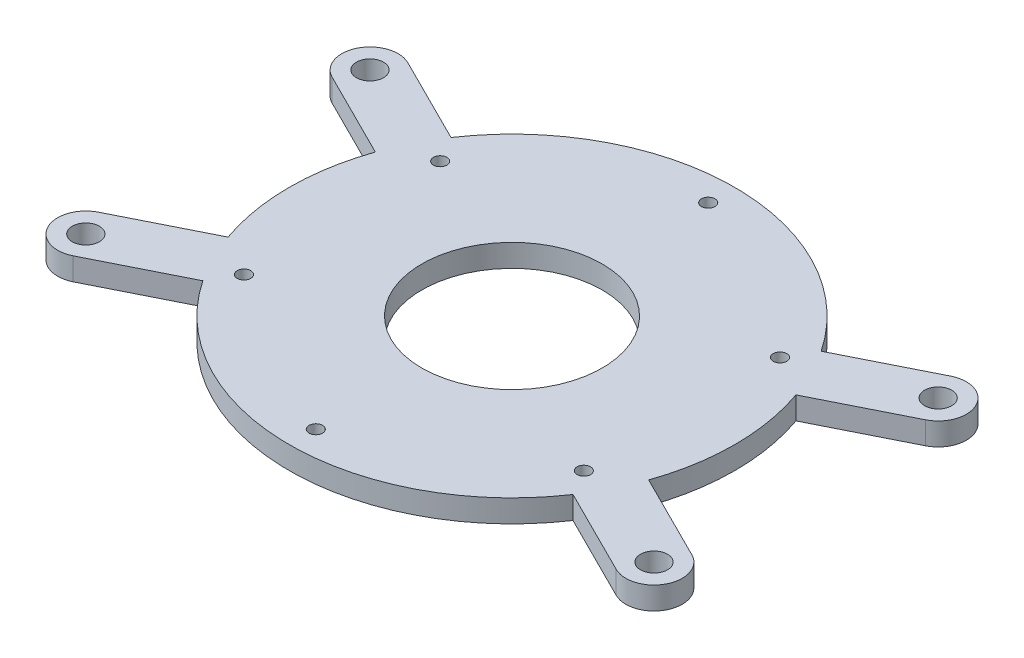
ISO-10303-21;
HEADER;
FILE_DESCRIPTION(('STEP AP214'),'2;1');
FILE_NAME('part.step','',(''),(''),'','','');
FILE_SCHEMA(('AUTOMOTIVE_DESIGN { 1 0 10303 214 1 1 1 1 }'));
ENDSEC;
DATA;
#1=APPLICATION_CONTEXT('core data for automotive mechanical design processes');
#2=APPLICATION_PROTOCOL_DEFINITION('international standard','automotive_design',2000,#1);
#3=PRODUCT_CONTEXT('',#1,'mechanical');
#4=PRODUCT('Part','Part','',(#3));
#5=PRODUCT_RELATED_PRODUCT_CATEGORY('part','',(#4));
#6=PRODUCT_DEFINITION_FORMATION('','',#4);
#7=PRODUCT_DEFINITION_CONTEXT('part definition',#1,'design');
#8=PRODUCT_DEFINITION('design','',#6,#7);
#9=PRODUCT_DEFINITION_SHAPE('','',#8);
#10=(LENGTH_UNIT() NAMED_UNIT(*) SI_UNIT(.MILLI.,.METRE.));
#11=(NAMED_UNIT(*) PLANE_ANGLE_UNIT() SI_UNIT($,.RADIAN.));
#12=(NAMED_UNIT(*) SI_UNIT($,.STERADIAN.) SOLID_ANGLE_UNIT());
#13=UNCERTAINTY_MEASURE_WITH_UNIT(LENGTH_MEASURE(1.E-05),#10,'distance_accuracy_value','');
#14=(GEOMETRIC_REPRESENTATION_CONTEXT(3) GLOBAL_UNCERTAINTY_ASSIGNED_CONTEXT((#13)) GLOBAL_UNIT_ASSIGNED_CONTEXT((#10,
#11,#12)) REPRESENTATION_CONTEXT('',''));
#15=CARTESIAN_POINT('',(0.,0.,0.));
#16=DIRECTION('',(0.,0.,1.));
#17=DIRECTION('',(1.,0.,0.));
#18=AXIS2_PLACEMENT_3D('',#15,#16,#17);
#19=CARTESIAN_POINT('',(0.,5.,0.));
#20=DIRECTION('',(0.,-1.,0.));
#21=DIRECTION('',(0.,0.,-1.));
#22=AXIS2_PLACEMENT_3D('',#19,#20,#21);
#23=CYLINDRICAL_SURFACE('',#22,49.4);
#24=CARTESIAN_POINT('',(0.,0.,0.));
#25=DIRECTION('',(0.,1.,0.));
#26=DIRECTION('',(0.,0.,1.));
#27=AXIS2_PLACEMENT_3D('',#24,#25,#26);
#28=CIRCLE('',#27,49.4);
#29=CARTESIAN_POINT('',(-41.0321866795471,0.,27.5085378799892));
#30=VERTEX_POINT('',#29);
#31=CARTESIAN_POINT('',(41.0321866795471,0.,27.5085378799892));
#32=VERTEX_POINT('',#31);
#33=EDGE_CURVE('E243',#30,#32,#28,.T.);
#34=ORIENTED_EDGE('',*,*,#33,.T.);
#35=DIRECTION('',(0.,-1.,0.));
#36=VECTOR('',#35,1.);
#37=CARTESIAN_POINT('',(41.0321866795471,5.,27.5085378799892));
#38=LINE('',#37,#36);
#39=CARTESIAN_POINT('',(41.0321866795471,5.,27.5085378799892));
#40=VERTEX_POINT('',#39);
#41=EDGE_CURVE('E12',#40,#32,#38,.T.);
#42=ORIENTED_EDGE('',*,*,#41,.F.);
#43=CARTESIAN_POINT('',(0.,5.,0.));
#44=DIRECTION('',(0.,1.,0.));
#45=DIRECTION('',(0.,0.,1.));
#46=AXIS2_PLACEMENT_3D('',#43,#44,#45);
#47=CIRCLE('',#46,49.4);
#48=CARTESIAN_POINT('',(-41.0321866795471,5.,27.5085378799892));
#49=VERTEX_POINT('',#48);
#50=EDGE_CURVE('E173',#49,#40,#47,.T.);
#51=ORIENTED_EDGE('',*,*,#50,.F.);
#52=DIRECTION('',(0.,-1.,0.));
#53=VECTOR('',#52,1.);
#54=CARTESIAN_POINT('',(-41.0321866795471,5.,27.5085378799892));
#55=LINE('',#54,#53);
#56=EDGE_CURVE('E239',#49,#30,#55,.T.);
#57=ORIENTED_EDGE('',*,*,#56,.T.);
#58=EDGE_LOOP('',(#34,#42,#51,#57));
#59=FACE_BOUND('',#58,.T.);
#60=ADVANCED_FACE('F91',(#59),#23,.T.);
#61=CARTESIAN_POINT('',(-2.79556780261695,5.,5.5899285023131));
#62=DIRECTION('',(-0.447290848418707,0.,0.894388560370085));
#63=DIRECTION('',(0.894388560370085,0.,0.447290848418707));
#64=AXIS2_PLACEMENT_3D('',#61,#62,#63);
#65=PLANE('',#64);
#66=DIRECTION('',(-0.894388560370085,0.,-0.447290848418707));
#67=VECTOR('',#66,1.);
#68=CARTESIAN_POINT('',(-2.79556780261695,0.,5.5899285023131));
#69=LINE('',#68,#67);
#70=CARTESIAN_POINT('',(60.1908307594318,0.,37.089928502313));
#71=VERTEX_POINT('',#70);
#72=EDGE_CURVE('E247',#71,#32,#69,.T.);
#73=ORIENTED_EDGE('',*,*,#72,.F.);
#74=DIRECTION('',(0.,-1.,0.));
#75=VECTOR('',#74,1.);
#76=CARTESIAN_POINT('',(60.1908307594318,5.,37.089928502313));
#77=LINE('',#76,#75);
#78=CARTESIAN_POINT('',(60.1908307594318,5.,37.089928502313));
#79=VERTEX_POINT('',#78);
#80=EDGE_CURVE('E101',#79,#71,#77,.T.);
#81=ORIENTED_EDGE('',*,*,#80,.F.);
#82=DIRECTION('',(-0.894388560370085,0.,-0.447290848418707));
#83=VECTOR('',#82,1.);
#84=CARTESIAN_POINT('',(-2.79556780261695,5.,5.5899285023131));
#85=LINE('',#84,#83);
#86=EDGE_CURVE('E323',#79,#40,#85,.T.);
#87=ORIENTED_EDGE('',*,*,#86,.T.);
#88=ORIENTED_EDGE('',*,*,#41,.T.);
#89=EDGE_LOOP('',(#73,#81,#87,#88));
#90=FACE_BOUND('',#89,.T.);
#91=ADVANCED_FACE('F404',(#90),#65,.T.);
#92=CARTESIAN_POINT('',(62.9863985620487,5.,31.5));
#93=DIRECTION('',(0.,-1.,0.));
#94=DIRECTION('',(0.,0.,-1.));
#95=AXIS2_PLACEMENT_3D('',#92,#93,#94);
#96=CYLINDRICAL_SURFACE('',#95,6.25);
#97=CARTESIAN_POINT('',(62.9863985620487,0.,31.5));
#98=DIRECTION('',(0.,1.,0.));
#99=DIRECTION('',(0.,0.,1.));
#100=AXIS2_PLACEMENT_3D('',#97,#98,#99);
#101=CIRCLE('',#100,6.25);
#102=CARTESIAN_POINT('',(65.7819663646656,0.,25.9100714976869));
#103=VERTEX_POINT('',#102);
#104=EDGE_CURVE('E252',#103,#71,#101,.F.);
#105=ORIENTED_EDGE('',*,*,#104,.F.);
#106=DIRECTION('',(0.,-1.,0.));
#107=VECTOR('',#106,1.);
#108=CARTESIAN_POINT('',(65.7819663646656,5.,25.9100714976869));
#109=LINE('',#108,#107);
#110=CARTESIAN_POINT('',(65.7819663646656,5.,25.9100714976869));
#111=VERTEX_POINT('',#110);
#112=EDGE_CURVE('E299',#111,#103,#109,.T.);
#113=ORIENTED_EDGE('',*,*,#112,.F.);
#114=CARTESIAN_POINT('',(62.9863985620487,5.,31.5));
#115=DIRECTION('',(0.,1.,0.));
#116=DIRECTION('',(0.,0.,1.));
#117=AXIS2_PLACEMENT_3D('',#114,#115,#116);
#118=CIRCLE('',#117,6.25);
#119=EDGE_CURVE('E327',#111,#79,#118,.F.);
#120=ORIENTED_EDGE('',*,*,#119,.T.);
#121=ORIENTED_EDGE('',*,*,#80,.T.);
#122=EDGE_LOOP('',(#105,#113,#120,#121));
#123=FACE_BOUND('',#122,.T.);
#124=ADVANCED_FACE('F409',(#123),#96,.T.);
#125=CARTESIAN_POINT('',(2.79556780261691,5.,-5.58992850231302));
#126=DIRECTION('',(-0.447290848418708,0.,0.894388560370085));
#127=DIRECTION('',(0.894388560370085,0.,0.447290848418708));
#128=AXIS2_PLACEMENT_3D('',#125,#126,#127);
#129=PLANE('',#128);
#130=DIRECTION('',(-0.894388560370085,0.,-0.447290848418707));
#131=VECTOR('',#130,1.);
#132=CARTESIAN_POINT('',(2.79556780261691,0.,-5.58992850231302));
#133=LINE('',#132,#131);
#134=CARTESIAN_POINT('',(46.623322284781,0.,16.3286808753631));
#135=VERTEX_POINT('',#134);
#136=EDGE_CURVE('E255',#103,#135,#133,.T.);
#137=ORIENTED_EDGE('',*,*,#136,.T.);
#138=DIRECTION('',(0.,-1.,0.));
#139=VECTOR('',#138,1.);
#140=CARTESIAN_POINT('',(46.623322284781,5.,16.3286808753631));
#141=LINE('',#140,#139);
#142=CARTESIAN_POINT('',(46.623322284781,5.,16.3286808753631));
#143=VERTEX_POINT('',#142);
#144=EDGE_CURVE('E296',#143,#135,#141,.T.);
#145=ORIENTED_EDGE('',*,*,#144,.F.);
#146=DIRECTION('',(-0.894388560370085,0.,-0.447290848418707));
#147=VECTOR('',#146,1.);
#148=CARTESIAN_POINT('',(2.79556780261691,5.,-5.58992850231302));
#149=LINE('',#148,#147);
#150=EDGE_CURVE('E330',#111,#143,#149,.T.);
#151=ORIENTED_EDGE('',*,*,#150,.F.);
#152=ORIENTED_EDGE('',*,*,#112,.T.);
#153=EDGE_LOOP('',(#137,#145,#151,#152));
#154=FACE_BOUND('',#153,.T.);
#155=ADVANCED_FACE('F415',(#154),#129,.F.);
#156=CARTESIAN_POINT('',(46.6233222847809,0.,-16.3286808753631));
#157=VERTEX_POINT('',#156);
#158=EDGE_CURVE('E249',#135,#157,#28,.T.);
#159=ORIENTED_EDGE('',*,*,#158,.T.);
#160=DIRECTION('',(0.,-1.,0.));
#161=VECTOR('',#160,1.);
#162=CARTESIAN_POINT('',(46.6233222847809,5.,-16.3286808753631));
#163=LINE('',#162,#161);
#164=CARTESIAN_POINT('',(46.6233222847809,5.,-16.3286808753631));
#165=VERTEX_POINT('',#164);
#166=EDGE_CURVE('E294',#165,#157,#163,.T.);
#167=ORIENTED_EDGE('',*,*,#166,.F.);
#168=EDGE_CURVE('E324',#143,#165,#47,.T.);
#169=ORIENTED_EDGE('',*,*,#168,.F.);
#170=ORIENTED_EDGE('',*,*,#144,.T.);
#171=EDGE_LOOP('',(#159,#167,#169,#170));
#172=FACE_BOUND('',#171,.T.);
#173=ADVANCED_FACE('F351',(#172),#23,.T.);
#174=CARTESIAN_POINT('',(2.79556780261692,5.,5.58992850231301));
#175=DIRECTION('',(0.447290848418708,0.,0.894388560370085));
#176=DIRECTION('',(0.894388560370085,0.,-0.447290848418708));
#177=AXIS2_PLACEMENT_3D('',#174,#175,#176);
#178=PLANE('',#177);
#179=DIRECTION('',(-0.894388560370085,0.,0.447290848418708));
#180=VECTOR('',#179,1.);
#181=CARTESIAN_POINT('',(2.79556780261692,0.,5.58992850231301));
#182=LINE('',#181,#180);
#183=CARTESIAN_POINT('',(65.7819663646656,0.,-25.910071497687));
#184=VERTEX_POINT('',#183);
#185=EDGE_CURVE('E257',#184,#157,#182,.T.);
#186=ORIENTED_EDGE('',*,*,#185,.F.);
#187=DIRECTION('',(0.,-1.,0.));
#188=VECTOR('',#187,1.);
#189=CARTESIAN_POINT('',(65.7819663646656,5.,-25.910071497687));
#190=LINE('',#189,#188);
#191=CARTESIAN_POINT('',(65.7819663646656,5.,-25.910071497687));
#192=VERTEX_POINT('',#191);
#193=EDGE_CURVE('E292',#192,#184,#190,.T.);
#194=ORIENTED_EDGE('',*,*,#193,.F.);
#195=DIRECTION('',(-0.894388560370085,0.,0.447290848418708));
#196=VECTOR('',#195,1.);
#197=CARTESIAN_POINT('',(2.79556780261692,5.,5.58992850231301));
#198=LINE('',#197,#196);
#199=EDGE_CURVE('E332',#192,#165,#198,.T.);
#200=ORIENTED_EDGE('',*,*,#199,.T.);
#201=ORIENTED_EDGE('',*,*,#166,.T.);
#202=EDGE_LOOP('',(#186,#194,#200,#201));
#203=FACE_BOUND('',#202,.T.);
#204=ADVANCED_FACE('F355',(#203),#178,.T.);
#205=CARTESIAN_POINT('',(62.9863985620487,5.,-31.5));
#206=DIRECTION('',(0.,-1.,0.));
#207=DIRECTION('',(0.,0.,-1.));
#208=AXIS2_PLACEMENT_3D('',#205,#206,#207);
#209=CYLINDRICAL_SURFACE('',#208,6.25);
#210=CARTESIAN_POINT('',(62.9863985620487,0.,-31.5));
#211=DIRECTION('',(0.,1.,0.));
#212=DIRECTION('',(0.,0.,1.));
#213=AXIS2_PLACEMENT_3D('',#210,#211,#212);
#214=CIRCLE('',#213,6.25);
#215=CARTESIAN_POINT('',(60.1908307594318,0.,-37.089928502313));
#216=VERTEX_POINT('',#215);
#217=EDGE_CURVE('E260',#184,#216,#214,.T.);
#218=ORIENTED_EDGE('',*,*,#217,.T.);
#219=DIRECTION('',(0.,-1.,0.));
#220=VECTOR('',#219,1.);
#221=CARTESIAN_POINT('',(60.1908307594318,5.,-37.089928502313));
#222=LINE('',#221,#220);
#223=CARTESIAN_POINT('',(60.1908307594318,5.,-37.089928502313));
#224=VERTEX_POINT('',#223);
#225=EDGE_CURVE('E289',#224,#216,#222,.T.);
#226=ORIENTED_EDGE('',*,*,#225,.F.);
#227=CARTESIAN_POINT('',(62.9863985620487,5.,-31.5));
#228=DIRECTION('',(0.,1.,0.));
#229=DIRECTION('',(0.,0.,1.));
#230=AXIS2_PLACEMENT_3D('',#227,#228,#229);
#231=CIRCLE('',#230,6.25);
#232=EDGE_CURVE('E335',#192,#224,#231,.T.);
#233=ORIENTED_EDGE('',*,*,#232,.F.);
#234=ORIENTED_EDGE('',*,*,#193,.T.);
#235=EDGE_LOOP('',(#218,#226,#233,#234));
#236=FACE_BOUND('',#235,.T.);
#237=ADVANCED_FACE('F360',(#236),#209,.T.);
#238=CARTESIAN_POINT('',(-2.79556780261696,5.,-5.58992850231311));
#239=DIRECTION('',(0.447290848418707,0.,0.894388560370085));
#240=DIRECTION('',(0.894388560370085,0.,-0.447290848418707));
#241=AXIS2_PLACEMENT_3D('',#238,#239,#240);
#242=PLANE('',#241);
#243=DIRECTION('',(-0.894388560370085,0.,0.447290848418707));
#244=VECTOR('',#243,1.);
#245=CARTESIAN_POINT('',(-2.79556780261696,0.,-5.58992850231311));
#246=LINE('',#245,#244);
#247=CARTESIAN_POINT('',(41.0321866795471,0.,-27.5085378799892));
#248=VERTEX_POINT('',#247);
#249=EDGE_CURVE('E262',#216,#248,#246,.T.);
#250=ORIENTED_EDGE('',*,*,#249,.T.);
#251=DIRECTION('',(0.,-1.,0.));
#252=VECTOR('',#251,1.);
#253=CARTESIAN_POINT('',(41.0321866795471,5.,-27.5085378799892));
#254=LINE('',#253,#252);
#255=CARTESIAN_POINT('',(41.0321866795471,5.,-27.5085378799892));
#256=VERTEX_POINT('',#255);
#257=EDGE_CURVE('E286',#256,#248,#254,.T.);
#258=ORIENTED_EDGE('',*,*,#257,.F.);
#259=DIRECTION('',(-0.894388560370085,0.,0.447290848418707));
#260=VECTOR('',#259,1.);
#261=CARTESIAN_POINT('',(-2.79556780261696,5.,-5.58992850231311));
#262=LINE('',#261,#260);
#263=EDGE_CURVE('E337',#224,#256,#262,.T.);
#264=ORIENTED_EDGE('',*,*,#263,.F.);
#265=ORIENTED_EDGE('',*,*,#225,.T.);
#266=EDGE_LOOP('',(#250,#258,#264,#265));
#267=FACE_BOUND('',#266,.T.);
#268=ADVANCED_FACE('F364',(#267),#242,.F.);
#269=CARTESIAN_POINT('',(-41.0321866795471,0.,-27.5085378799892));
#270=VERTEX_POINT('',#269);
#271=EDGE_CURVE('E264',#248,#270,#28,.T.);
#272=ORIENTED_EDGE('',*,*,#271,.T.);
#273=DIRECTION('',(0.,-1.,0.));
#274=VECTOR('',#273,1.);
#275=CARTESIAN_POINT('',(-41.0321866795471,5.,-27.5085378799892));
#276=LINE('',#275,#274);
#277=CARTESIAN_POINT('',(-41.0321866795471,5.,-27.5085378799892));
#278=VERTEX_POINT('',#277);
#279=EDGE_CURVE('E284',#278,#270,#276,.T.);
#280=ORIENTED_EDGE('',*,*,#279,.F.);
#281=EDGE_CURVE('E234',#256,#278,#47,.T.);
#282=ORIENTED_EDGE('',*,*,#281,.F.);
#283=ORIENTED_EDGE('',*,*,#257,.T.);
#284=EDGE_LOOP('',(#272,#280,#282,#283));
#285=FACE_BOUND('',#284,.T.);
#286=ADVANCED_FACE('F369',(#285),#23,.T.);
#287=CARTESIAN_POINT('',(2.79556780261696,5.,-5.58992850231311));
#288=DIRECTION('',(0.447290848418707,0.,-0.894388560370085));
#289=DIRECTION('',(-0.894388560370085,0.,-0.447290848418707));
#290=AXIS2_PLACEMENT_3D('',#287,#288,#289);
#291=PLANE('',#290);
#292=DIRECTION('',(0.894388560370085,0.,0.447290848418707));
#293=VECTOR('',#292,1.);
#294=CARTESIAN_POINT('',(2.79556780261696,0.,-5.58992850231311));
#295=LINE('',#294,#293);
#296=CARTESIAN_POINT('',(-60.1908307594318,0.,-37.089928502313));
#297=VERTEX_POINT('',#296);
#298=EDGE_CURVE('E265',#297,#270,#295,.T.);
#299=ORIENTED_EDGE('',*,*,#298,.F.);
#300=DIRECTION('',(0.,-1.,0.));
#301=VECTOR('',#300,1.);
#302=CARTESIAN_POINT('',(-60.1908307594318,5.,-37.089928502313));
#303=LINE('',#302,#301);
#304=CARTESIAN_POINT('',(-60.1908307594318,5.,-37.089928502313));
#305=VERTEX_POINT('',#304);
#306=EDGE_CURVE('E282',#305,#297,#303,.T.);
#307=ORIENTED_EDGE('',*,*,#306,.F.);
#308=DIRECTION('',(0.894388560370085,0.,0.447290848418707));
#309=VECTOR('',#308,1.);
#310=CARTESIAN_POINT('',(2.79556780261696,5.,-5.58992850231311));
#311=LINE('',#310,#309);
#312=EDGE_CURVE('E338',#305,#278,#311,.T.);
#313=ORIENTED_EDGE('',*,*,#312,.T.);
#314=ORIENTED_EDGE('',*,*,#279,.T.);
#315=EDGE_LOOP('',(#299,#307,#313,#314));
#316=FACE_BOUND('',#315,.T.);
#317=ADVANCED_FACE('F370',(#316),#291,.T.);
#318=CARTESIAN_POINT('',(-2.7955678026169,5.,5.58992850231299));
#319=DIRECTION('',(0.447290848418708,0.,-0.894388560370085));
#320=DIRECTION('',(-0.894388560370085,0.,-0.447290848418708));
#321=AXIS2_PLACEMENT_3D('',#318,#319,#320);
#322=PLANE('',#321);
#323=DIRECTION('',(0.894388560370085,0.,0.447290848418708));
#324=VECTOR('',#323,1.);
#325=CARTESIAN_POINT('',(-2.7955678026169,0.,5.58992850231299));
#326=LINE('',#325,#324);
#327=CARTESIAN_POINT('',(-65.7819663646656,0.,-25.9100714976869));
#328=VERTEX_POINT('',#327);
#329=CARTESIAN_POINT('',(-46.6233222847809,0.,-16.3286808753631));
#330=VERTEX_POINT('',#329);
#331=EDGE_CURVE('E268',#328,#330,#326,.T.);
#332=ORIENTED_EDGE('',*,*,#331,.T.);
#333=DIRECTION('',(0.,-1.,0.));
#334=VECTOR('',#333,1.);
#335=CARTESIAN_POINT('',(-46.6233222847809,5.,-16.3286808753631));
#336=LINE('',#335,#334);
#337=CARTESIAN_POINT('',(-46.6233222847809,5.,-16.3286808753631));
#338=VERTEX_POINT('',#337);
#339=EDGE_CURVE('E277',#338,#330,#336,.T.);
#340=ORIENTED_EDGE('',*,*,#339,.F.);
#341=DIRECTION('',(0.894388560370085,0.,0.447290848418708));
#342=VECTOR('',#341,1.);
#343=CARTESIAN_POINT('',(-2.7955678026169,5.,5.58992850231299));
#344=LINE('',#343,#342);
#345=CARTESIAN_POINT('',(-65.7819663646656,5.,-25.9100714976869));
#346=VERTEX_POINT('',#345);
#347=EDGE_CURVE('E232',#346,#338,#344,.T.);
#348=ORIENTED_EDGE('',*,*,#347,.F.);
#349=DIRECTION('',(0.,-1.,0.));
#350=VECTOR('',#349,1.);
#351=CARTESIAN_POINT('',(-65.7819663646656,5.,-25.9100714976869));
#352=LINE('',#351,#350);
#353=EDGE_CURVE('E280',#346,#328,#352,.T.);
#354=ORIENTED_EDGE('',*,*,#353,.T.);
#355=EDGE_LOOP('',(#332,#340,#348,#354));
#356=FACE_BOUND('',#355,.T.);
#357=ADVANCED_FACE('F417',(#356),#322,.F.);
#358=CARTESIAN_POINT('',(-46.6233222847809,0.,16.3286808753631));
#359=VERTEX_POINT('',#358);
#360=EDGE_CURVE('E248',#330,#359,#28,.T.);
#361=ORIENTED_EDGE('',*,*,#360,.T.);
#362=DIRECTION('',(0.,-1.,0.));
#363=VECTOR('',#362,1.);
#364=CARTESIAN_POINT('',(-46.6233222847809,5.,16.3286808753631));
#365=LINE('',#364,#363);
#366=CARTESIAN_POINT('',(-46.6233222847809,5.,16.3286808753631));
#367=VERTEX_POINT('',#366);
#368=EDGE_CURVE('E221',#367,#359,#365,.T.);
#369=ORIENTED_EDGE('',*,*,#368,.F.);
#370=EDGE_CURVE('E229',#338,#367,#47,.T.);
#371=ORIENTED_EDGE('',*,*,#370,.F.);
#372=ORIENTED_EDGE('',*,*,#339,.T.);
#373=EDGE_LOOP('',(#361,#369,#371,#372));
#374=FACE_BOUND('',#373,.T.);
#375=ADVANCED_FACE('F376',(#374),#23,.T.);
#376=CARTESIAN_POINT('',(-2.7955678026169,5.,-5.58992850231299));
#377=DIRECTION('',(-0.447290848418708,0.,-0.894388560370085));
#378=DIRECTION('',(-0.894388560370085,0.,0.447290848418708));
#379=AXIS2_PLACEMENT_3D('',#376,#377,#378);
#380=PLANE('',#379);
#381=DIRECTION('',(0.894388560370085,0.,-0.447290848418708));
#382=VECTOR('',#381,1.);
#383=CARTESIAN_POINT('',(-2.7955678026169,0.,-5.58992850231299));
#384=LINE('',#383,#382);
#385=CARTESIAN_POINT('',(-65.7819663646656,0.,25.9100714976869));
#386=VERTEX_POINT('',#385);
#387=EDGE_CURVE('E220',#386,#359,#384,.T.);
#388=ORIENTED_EDGE('',*,*,#387,.F.);
#389=DIRECTION('',(0.,-1.,0.));
#390=VECTOR('',#389,1.);
#391=CARTESIAN_POINT('',(-65.7819663646656,5.,25.9100714976869));
#392=LINE('',#391,#390);
#393=CARTESIAN_POINT('',(-65.7819663646656,5.,25.9100714976869));
#394=VERTEX_POINT('',#393);
#395=EDGE_CURVE('E214',#394,#386,#392,.T.);
#396=ORIENTED_EDGE('',*,*,#395,.F.);
#397=DIRECTION('',(0.894388560370085,0.,-0.447290848418708));
#398=VECTOR('',#397,1.);
#399=CARTESIAN_POINT('',(-2.7955678026169,5.,-5.58992850231299));
#400=LINE('',#399,#398);
#401=EDGE_CURVE('E218',#394,#367,#400,.T.);
#402=ORIENTED_EDGE('',*,*,#401,.T.);
#403=ORIENTED_EDGE('',*,*,#368,.T.);
#404=EDGE_LOOP('',(#388,#396,#402,#403));
#405=FACE_BOUND('',#404,.T.);
#406=ADVANCED_FACE('F216',(#405),#380,.T.);
#407=CARTESIAN_POINT('',(-62.9863985620487,5.,31.5));
#408=DIRECTION('',(0.,-1.,0.));
#409=DIRECTION('',(0.,0.,-1.));
#410=AXIS2_PLACEMENT_3D('',#407,#408,#409);
#411=CYLINDRICAL_SURFACE('',#410,6.25000000000001);
#412=CARTESIAN_POINT('',(-62.9863985620487,0.,31.5));
#413=DIRECTION('',(0.,1.,0.));
#414=DIRECTION('',(0.,0.,1.));
#415=AXIS2_PLACEMENT_3D('',#412,#413,#414);
#416=CIRCLE('',#415,6.25000000000001);
#417=CARTESIAN_POINT('',(-60.1908307594318,0.,37.089928502313));
#418=VERTEX_POINT('',#417);
#419=EDGE_CURVE('E161',#386,#418,#416,.T.);
#420=ORIENTED_EDGE('',*,*,#419,.T.);
#421=DIRECTION('',(0.,-1.,0.));
#422=VECTOR('',#421,1.);
#423=CARTESIAN_POINT('',(-60.1908307594318,5.,37.089928502313));
#424=LINE('',#423,#422);
#425=CARTESIAN_POINT('',(-60.1908307594318,5.,37.089928502313));
#426=VERTEX_POINT('',#425);
#427=EDGE_CURVE('E222',#426,#418,#424,.T.);
#428=ORIENTED_EDGE('',*,*,#427,.F.);
#429=CARTESIAN_POINT('',(-62.9863985620487,5.,31.5));
#430=DIRECTION('',(0.,1.,0.));
#431=DIRECTION('',(0.,0.,1.));
#432=AXIS2_PLACEMENT_3D('',#429,#430,#431);
#433=CIRCLE('',#432,6.25000000000001);
#434=EDGE_CURVE('E224',#394,#426,#433,.T.);
#435=ORIENTED_EDGE('',*,*,#434,.F.);
#436=ORIENTED_EDGE('',*,*,#395,.T.);
#437=EDGE_LOOP('',(#420,#428,#435,#436));
#438=FACE_BOUND('',#437,.T.);
#439=ADVANCED_FACE('F225',(#438),#411,.T.);
#440=CARTESIAN_POINT('',(0.,5.,0.));
#441=DIRECTION('',(0.,-1.,0.));
#442=DIRECTION('',(0.,0.,-1.));
#443=AXIS2_PLACEMENT_3D('',#440,#441,#442);
#444=CYLINDRICAL_SURFACE('',#443,20.);
#445=CARTESIAN_POINT('',(0.,5.,0.));
#446=DIRECTION('',(0.,1.,0.));
#447=DIRECTION('',(0.,0.,1.));
#448=AXIS2_PLACEMENT_3D('',#445,#446,#447);
#449=CIRCLE('',#448,20.);
#450=CARTESIAN_POINT('',(0.,5.,20.));
#451=VERTEX_POINT('',#450);
#452=EDGE_CURVE('E273',#451,#451,#449,.T.);
#453=ORIENTED_EDGE('',*,*,#452,.T.);
#454=EDGE_LOOP('',(#453));
#455=FACE_BOUND('',#454,.T.);
#456=CARTESIAN_POINT('',(0.,0.,0.));
#457=DIRECTION('',(0.,1.,0.));
#458=DIRECTION('',(0.,0.,1.));
#459=AXIS2_PLACEMENT_3D('',#456,#457,#458);
#460=CIRCLE('',#459,20.);
#461=CARTESIAN_POINT('',(0.,0.,20.));
#462=VERTEX_POINT('',#461);
#463=EDGE_CURVE('E240',#462,#462,#460,.T.);
#464=ORIENTED_EDGE('',*,*,#463,.F.);
#465=EDGE_LOOP('',(#464));
#466=FACE_BOUND('',#465,.T.);
#467=ADVANCED_FACE('F382',(#455,#466),#444,.F.);
#468=CARTESIAN_POINT('',(2.79556780261696,5.,5.58992850231311));
#469=DIRECTION('',(-0.447290848418707,0.,-0.894388560370085));
#470=DIRECTION('',(-0.894388560370085,0.,0.447290848418707));
#471=AXIS2_PLACEMENT_3D('',#468,#469,#470);
#472=PLANE('',#471);
#473=DIRECTION('',(0.894388560370085,0.,-0.447290848418707));
#474=VECTOR('',#473,1.);
#475=CARTESIAN_POINT('',(2.79556780261696,0.,5.58992850231311));
#476=LINE('',#475,#474);
#477=EDGE_CURVE('E167',#418,#30,#476,.T.);
#478=ORIENTED_EDGE('',*,*,#477,.T.);
#479=ORIENTED_EDGE('',*,*,#56,.F.);
#480=DIRECTION('',(0.894388560370085,0.,-0.447290848418707));
#481=VECTOR('',#480,1.);
#482=CARTESIAN_POINT('',(2.79556780261696,5.,5.58992850231311));
#483=LINE('',#482,#481);
#484=EDGE_CURVE('E110',#426,#49,#483,.T.);
#485=ORIENTED_EDGE('',*,*,#484,.F.);
#486=ORIENTED_EDGE('',*,*,#427,.T.);
#487=EDGE_LOOP('',(#478,#479,#485,#486));
#488=FACE_BOUND('',#487,.T.);
#489=ADVANCED_FACE('F380',(#488),#472,.F.);
#490=CARTESIAN_POINT('',(0.,5.,0.));
#491=DIRECTION('',(0.,1.,0.));
#492=DIRECTION('',(0.,0.,1.));
#493=AXIS2_PLACEMENT_3D('',#490,#491,#492);
#494=PLANE('',#493);
#495=CARTESIAN_POINT('',(-37.6721050646228,5.,21.7500000000004));
#496=DIRECTION('',(0.,-1.,0.));
#497=DIRECTION('',(0.866025403784433,0.,-0.50000000000001));
#498=AXIS2_PLACEMENT_3D('',#495,#496,#497);
#499=CIRCLE('',#498,1.5);
#500=CARTESIAN_POINT('',(-36.3730669589462,5.,21.0000000000004));
#501=VERTEX_POINT('',#500);
#502=EDGE_CURVE('E676',#501,#501,#499,.T.);
#503=ORIENTED_EDGE('',*,*,#502,.T.);
#504=EDGE_LOOP('',(#503));
#505=FACE_BOUND('',#504,.T.);
#506=CARTESIAN_POINT('',(-37.6721050646233,5.,-21.7499999999996));
#507=DIRECTION('',(0.,-1.,0.));
#508=DIRECTION('',(0.866025403784443,0.,0.499999999999992));
#509=AXIS2_PLACEMENT_3D('',#506,#507,#508);
#510=CIRCLE('',#509,1.5);
#511=CARTESIAN_POINT('',(-36.3730669589466,5.,-20.9999999999997));
#512=VERTEX_POINT('',#511);
#513=EDGE_CURVE('E757',#512,#512,#510,.T.);
#514=ORIENTED_EDGE('',*,*,#513,.T.);
#515=EDGE_LOOP('',(#514));
#516=FACE_BOUND('',#515,.T.);
#517=CARTESIAN_POINT('',(0.,5.,-43.5));
#518=DIRECTION('',(0.,-1.,0.));
#519=DIRECTION('',(0.,0.,1.));
#520=AXIS2_PLACEMENT_3D('',#517,#518,#519);
#521=CIRCLE('',#520,1.5);
#522=CARTESIAN_POINT('',(0.,5.,-42.));
#523=VERTEX_POINT('',#522);
#524=EDGE_CURVE('E749',#523,#523,#521,.T.);
#525=ORIENTED_EDGE('',*,*,#524,.T.);
#526=EDGE_LOOP('',(#525));
#527=FACE_BOUND('',#526,.T.);
#528=CARTESIAN_POINT('',(37.672105064623,5.,-21.7500000000002));
#529=DIRECTION('',(0.,-1.,0.));
#530=DIRECTION('',(-0.866025403784436,0.,0.500000000000004));
#531=AXIS2_PLACEMENT_3D('',#528,#529,#530);
#532=CIRCLE('',#531,1.5);
#533=CARTESIAN_POINT('',(36.3730669589463,5.,-21.0000000000002));
#534=VERTEX_POINT('',#533);
#535=EDGE_CURVE('E692',#534,#534,#532,.T.);
#536=ORIENTED_EDGE('',*,*,#535,.T.);
#537=EDGE_LOOP('',(#536));
#538=FACE_BOUND('',#537,.T.);
#539=CARTESIAN_POINT('',(37.6721050646231,5.,21.7499999999999));
#540=DIRECTION('',(0.,-1.,0.));
#541=DIRECTION('',(-0.86602540378444,0.,-0.499999999999998));
#542=AXIS2_PLACEMENT_3D('',#539,#540,#541);
#543=CIRCLE('',#542,1.5);
#544=CARTESIAN_POINT('',(36.3730669589465,5.,20.9999999999999));
#545=VERTEX_POINT('',#544);
#546=EDGE_CURVE('E685',#545,#545,#543,.T.);
#547=ORIENTED_EDGE('',*,*,#546,.T.);
#548=EDGE_LOOP('',(#547));
#549=FACE_BOUND('',#548,.T.);
#550=CARTESIAN_POINT('',(0.,5.,43.5));
#551=DIRECTION('',(0.,-1.,0.));
#552=DIRECTION('',(0.,0.,-1.));
#553=AXIS2_PLACEMENT_3D('',#550,#551,#552);
#554=CIRCLE('',#553,1.5);
#555=CARTESIAN_POINT('',(0.,5.,42.));
#556=VERTEX_POINT('',#555);
#557=EDGE_CURVE('E693',#556,#556,#554,.T.);
#558=ORIENTED_EDGE('',*,*,#557,.T.);
#559=EDGE_LOOP('',(#558));
#560=FACE_BOUND('',#559,.T.);
#561=CARTESIAN_POINT('',(62.9863985620487,5.,-31.5));
#562=DIRECTION('',(0.,-1.,0.));
#563=DIRECTION('',(0.,0.,1.));
#564=AXIS2_PLACEMENT_3D('',#561,#562,#563);
#565=CIRCLE('',#564,3.00000000000001);
#566=CARTESIAN_POINT('',(62.9863985620487,5.,-28.5));
#567=VERTEX_POINT('',#566);
#568=EDGE_CURVE('E699',#567,#567,#565,.T.);
#569=ORIENTED_EDGE('',*,*,#568,.T.);
#570=EDGE_LOOP('',(#569));
#571=FACE_BOUND('',#570,.T.);
#572=CARTESIAN_POINT('',(62.9863985620487,5.,31.5));
#573=DIRECTION('',(0.,1.,0.));
#574=DIRECTION('',(0.,0.,-1.));
#575=AXIS2_PLACEMENT_3D('',#572,#573,#574);
#576=CIRCLE('',#575,3.00000000000001);
#577=CARTESIAN_POINT('',(62.9863985620487,5.,28.5));
#578=VERTEX_POINT('',#577);
#579=EDGE_CURVE('E702',#578,#578,#576,.T.);
#580=ORIENTED_EDGE('',*,*,#579,.F.);
#581=EDGE_LOOP('',(#580));
#582=FACE_BOUND('',#581,.T.);
#583=CARTESIAN_POINT('',(-62.9863985620487,5.,31.5));
#584=DIRECTION('',(0.,-1.,0.));
#585=DIRECTION('',(0.,0.,-1.));
#586=AXIS2_PLACEMENT_3D('',#583,#584,#585);
#587=CIRCLE('',#586,3.00000000000001);
#588=CARTESIAN_POINT('',(-62.9863985620487,5.,28.5));
#589=VERTEX_POINT('',#588);
#590=EDGE_CURVE('E317',#589,#589,#587,.T.);
#591=ORIENTED_EDGE('',*,*,#590,.T.);
#592=EDGE_LOOP('',(#591));
#593=FACE_BOUND('',#592,.T.);
#594=CARTESIAN_POINT('',(-62.9863985620487,5.,-31.5));
#595=DIRECTION('',(0.,1.,0.));
#596=DIRECTION('',(0.,0.,1.));
#597=AXIS2_PLACEMENT_3D('',#594,#595,#596);
#598=CIRCLE('',#597,3.00000000000001);
#599=CARTESIAN_POINT('',(-62.9863985620487,5.,-28.5));
#600=VERTEX_POINT('',#599);
#601=EDGE_CURVE('E312',#600,#600,#598,.T.);
#602=ORIENTED_EDGE('',*,*,#601,.F.);
#603=EDGE_LOOP('',(#602));
#604=FACE_BOUND('',#603,.T.);
#605=ORIENTED_EDGE('',*,*,#452,.F.);
#606=EDGE_LOOP('',(#605));
#607=FACE_BOUND('',#606,.T.);
#608=ORIENTED_EDGE('',*,*,#50,.T.);
#609=ORIENTED_EDGE('',*,*,#86,.F.);
#610=ORIENTED_EDGE('',*,*,#119,.F.);
#611=ORIENTED_EDGE('',*,*,#150,.T.);
#612=ORIENTED_EDGE('',*,*,#168,.T.);
#613=ORIENTED_EDGE('',*,*,#199,.F.);
#614=ORIENTED_EDGE('',*,*,#232,.T.);
#615=ORIENTED_EDGE('',*,*,#263,.T.);
#616=ORIENTED_EDGE('',*,*,#281,.T.);
#617=ORIENTED_EDGE('',*,*,#312,.F.);
#618=CARTESIAN_POINT('',(-62.9863985620487,5.,-31.5));
#619=DIRECTION('',(0.,-1.,0.));
#620=DIRECTION('',(0.,0.,-1.));
#621=AXIS2_PLACEMENT_3D('',#618,#619,#620);
#622=CIRCLE('',#621,6.25000000000001);
#623=EDGE_CURVE('E244',#346,#305,#622,.T.);
#624=ORIENTED_EDGE('',*,*,#623,.F.);
#625=ORIENTED_EDGE('',*,*,#347,.T.);
#626=ORIENTED_EDGE('',*,*,#370,.T.);
#627=ORIENTED_EDGE('',*,*,#401,.F.);
#628=ORIENTED_EDGE('',*,*,#434,.T.);
#629=ORIENTED_EDGE('',*,*,#484,.T.);
#630=EDGE_LOOP('',(#608,#609,#610,#611,#612,#613,#614,#615,#616,#617,#624,#625,#626,#627,#628,#629));
#631=FACE_BOUND('',#630,.T.);
#632=ADVANCED_FACE('F227',(#505,#516,#527,#538,#549,#560,#571,#582,#593,#604,#607,#631),#494,.T.);
#633=CARTESIAN_POINT('',(0.,0.,0.));
#634=DIRECTION('',(0.,1.,0.));
#635=DIRECTION('',(0.,0.,1.));
#636=AXIS2_PLACEMENT_3D('',#633,#634,#635);
#637=PLANE('',#636);
#638=CARTESIAN_POINT('',(-37.6721050646228,0.,21.7500000000004));
#639=DIRECTION('',(0.,-1.,0.));
#640=DIRECTION('',(0.866025403784433,0.,-0.50000000000001));
#641=AXIS2_PLACEMENT_3D('',#638,#639,#640);
#642=CIRCLE('',#641,1.5);
#643=CARTESIAN_POINT('',(-36.3730669589462,0.,21.0000000000004));
#644=VERTEX_POINT('',#643);
#645=EDGE_CURVE('E679',#644,#644,#642,.T.);
#646=ORIENTED_EDGE('',*,*,#645,.F.);
#647=EDGE_LOOP('',(#646));
#648=FACE_BOUND('',#647,.T.);
#649=CARTESIAN_POINT('',(-37.6721050646233,0.,-21.7499999999996));
#650=DIRECTION('',(0.,-1.,0.));
#651=DIRECTION('',(0.866025403784443,0.,0.499999999999992));
#652=AXIS2_PLACEMENT_3D('',#649,#650,#651);
#653=CIRCLE('',#652,1.5);
#654=CARTESIAN_POINT('',(-36.3730669589466,0.,-20.9999999999997));
#655=VERTEX_POINT('',#654);
#656=EDGE_CURVE('E681',#655,#655,#653,.T.);
#657=ORIENTED_EDGE('',*,*,#656,.F.);
#658=EDGE_LOOP('',(#657));
#659=FACE_BOUND('',#658,.T.);
#660=CARTESIAN_POINT('',(0.,0.,-43.5));
#661=DIRECTION('',(0.,-1.,0.));
#662=DIRECTION('',(0.,0.,1.));
#663=AXIS2_PLACEMENT_3D('',#660,#661,#662);
#664=CIRCLE('',#663,1.5);
#665=CARTESIAN_POINT('',(0.,0.,-42.));
#666=VERTEX_POINT('',#665);
#667=EDGE_CURVE('E754',#666,#666,#664,.T.);
#668=ORIENTED_EDGE('',*,*,#667,.F.);
#669=EDGE_LOOP('',(#668));
#670=FACE_BOUND('',#669,.T.);
#671=CARTESIAN_POINT('',(37.672105064623,0.,-21.7500000000002));
#672=DIRECTION('',(0.,-1.,0.));
#673=DIRECTION('',(-0.866025403784436,0.,0.500000000000004));
#674=AXIS2_PLACEMENT_3D('',#671,#672,#673);
#675=CIRCLE('',#674,1.5);
#676=CARTESIAN_POINT('',(36.3730669589463,0.,-21.0000000000002));
#677=VERTEX_POINT('',#676);
#678=EDGE_CURVE('E744',#677,#677,#675,.T.);
#679=ORIENTED_EDGE('',*,*,#678,.F.);
#680=EDGE_LOOP('',(#679));
#681=FACE_BOUND('',#680,.T.);
#682=CARTESIAN_POINT('',(37.6721050646231,0.,21.7499999999999));
#683=DIRECTION('',(0.,-1.,0.));
#684=DIRECTION('',(-0.86602540378444,0.,-0.499999999999998));
#685=AXIS2_PLACEMENT_3D('',#682,#683,#684);
#686=CIRCLE('',#685,1.5);
#687=CARTESIAN_POINT('',(36.3730669589465,0.,20.9999999999999));
#688=VERTEX_POINT('',#687);
#689=EDGE_CURVE('E689',#688,#688,#686,.T.);
#690=ORIENTED_EDGE('',*,*,#689,.F.);
#691=EDGE_LOOP('',(#690));
#692=FACE_BOUND('',#691,.T.);
#693=CARTESIAN_POINT('',(0.,0.,43.5));
#694=DIRECTION('',(0.,-1.,0.));
#695=DIRECTION('',(0.,0.,-1.));
#696=AXIS2_PLACEMENT_3D('',#693,#694,#695);
#697=CIRCLE('',#696,1.5);
#698=CARTESIAN_POINT('',(0.,0.,42.));
#699=VERTEX_POINT('',#698);
#700=EDGE_CURVE('E688',#699,#699,#697,.T.);
#701=ORIENTED_EDGE('',*,*,#700,.F.);
#702=EDGE_LOOP('',(#701));
#703=FACE_BOUND('',#702,.T.);
#704=CARTESIAN_POINT('',(62.9863985620487,0.,-31.5));
#705=DIRECTION('',(0.,1.,0.));
#706=DIRECTION('',(0.,0.,1.));
#707=AXIS2_PLACEMENT_3D('',#704,#705,#706);
#708=CIRCLE('',#707,3.00000000000001);
#709=CARTESIAN_POINT('',(62.9863985620487,0.,-28.5));
#710=VERTEX_POINT('',#709);
#711=EDGE_CURVE('E696',#710,#710,#708,.T.);
#712=ORIENTED_EDGE('',*,*,#711,.T.);
#713=EDGE_LOOP('',(#712));
#714=FACE_BOUND('',#713,.T.);
#715=CARTESIAN_POINT('',(62.9863985620487,0.,31.5));
#716=DIRECTION('',(0.,1.,0.));
#717=DIRECTION('',(0.,0.,1.));
#718=AXIS2_PLACEMENT_3D('',#715,#716,#717);
#719=CIRCLE('',#718,3.00000000000001);
#720=CARTESIAN_POINT('',(62.9863985620487,0.,34.5));
#721=VERTEX_POINT('',#720);
#722=EDGE_CURVE('E707',#721,#721,#719,.F.);
#723=ORIENTED_EDGE('',*,*,#722,.F.);
#724=EDGE_LOOP('',(#723));
#725=FACE_BOUND('',#724,.T.);
#726=CARTESIAN_POINT('',(-62.9863985620487,0.,31.5));
#727=DIRECTION('',(0.,1.,0.));
#728=DIRECTION('',(0.,0.,1.));
#729=AXIS2_PLACEMENT_3D('',#726,#727,#728);
#730=CIRCLE('',#729,3.00000000000001);
#731=CARTESIAN_POINT('',(-62.9863985620487,0.,34.5));
#732=VERTEX_POINT('',#731);
#733=EDGE_CURVE('E710',#732,#732,#730,.T.);
#734=ORIENTED_EDGE('',*,*,#733,.T.);
#735=EDGE_LOOP('',(#734));
#736=FACE_BOUND('',#735,.T.);
#737=CARTESIAN_POINT('',(-62.9863985620487,0.,-31.5));
#738=DIRECTION('',(0.,1.,0.));
#739=DIRECTION('',(0.,0.,1.));
#740=AXIS2_PLACEMENT_3D('',#737,#738,#739);
#741=CIRCLE('',#740,3.00000000000001);
#742=CARTESIAN_POINT('',(-62.9863985620487,0.,-28.5));
#743=VERTEX_POINT('',#742);
#744=EDGE_CURVE('E306',#743,#743,#741,.F.);
#745=ORIENTED_EDGE('',*,*,#744,.F.);
#746=EDGE_LOOP('',(#745));
#747=FACE_BOUND('',#746,.T.);
#748=ORIENTED_EDGE('',*,*,#463,.T.);
#749=EDGE_LOOP('',(#748));
#750=FACE_BOUND('',#749,.T.);
#751=ORIENTED_EDGE('',*,*,#33,.F.);
#752=ORIENTED_EDGE('',*,*,#477,.F.);
#753=ORIENTED_EDGE('',*,*,#419,.F.);
#754=ORIENTED_EDGE('',*,*,#387,.T.);
#755=ORIENTED_EDGE('',*,*,#360,.F.);
#756=ORIENTED_EDGE('',*,*,#331,.F.);
#757=CARTESIAN_POINT('',(-62.9863985620487,0.,-31.5));
#758=DIRECTION('',(0.,-1.,0.));
#759=DIRECTION('',(0.,0.,-1.));
#760=AXIS2_PLACEMENT_3D('',#757,#758,#759);
#761=CIRCLE('',#760,6.25000000000001);
#762=EDGE_CURVE('E95',#328,#297,#761,.T.);
#763=ORIENTED_EDGE('',*,*,#762,.T.);
#764=ORIENTED_EDGE('',*,*,#298,.T.);
#765=ORIENTED_EDGE('',*,*,#271,.F.);
#766=ORIENTED_EDGE('',*,*,#249,.F.);
#767=ORIENTED_EDGE('',*,*,#217,.F.);
#768=ORIENTED_EDGE('',*,*,#185,.T.);
#769=ORIENTED_EDGE('',*,*,#158,.F.);
#770=ORIENTED_EDGE('',*,*,#136,.F.);
#771=ORIENTED_EDGE('',*,*,#104,.T.);
#772=ORIENTED_EDGE('',*,*,#72,.T.);
#773=EDGE_LOOP('',(#751,#752,#753,#754,#755,#756,#763,#764,#765,#766,#767,#768,#769,#770,#771,#772));
#774=FACE_BOUND('',#773,.T.);
#775=ADVANCED_FACE('F372',(#648,#659,#670,#681,#692,#703,#714,#725,#736,#747,#750,#774),#637,.F.);
#776=CARTESIAN_POINT('',(-62.9863985620487,5.,-31.5));
#777=DIRECTION('',(0.,-1.,0.));
#778=DIRECTION('',(0.,0.,-1.));
#779=AXIS2_PLACEMENT_3D('',#776,#777,#778);
#780=CYLINDRICAL_SURFACE('',#779,6.25000000000001);
#781=ORIENTED_EDGE('',*,*,#623,.T.);
#782=ORIENTED_EDGE('',*,*,#306,.T.);
#783=ORIENTED_EDGE('',*,*,#762,.F.);
#784=ORIENTED_EDGE('',*,*,#353,.F.);
#785=EDGE_LOOP('',(#781,#782,#783,#784));
#786=FACE_BOUND('',#785,.T.);
#787=ADVANCED_FACE('F93',(#786),#780,.T.);
#788=CARTESIAN_POINT('',(-62.9863985620487,-0.00100000000000013,-31.5));
#789=DIRECTION('',(0.,1.,0.));
#790=DIRECTION('',(0.,0.,1.));
#791=AXIS2_PLACEMENT_3D('',#788,#789,#790);
#792=CYLINDRICAL_SURFACE('',#791,3.00000000000001);
#793=ORIENTED_EDGE('',*,*,#601,.T.);
#794=EDGE_LOOP('',(#793));
#795=FACE_BOUND('',#794,.T.);
#796=ORIENTED_EDGE('',*,*,#744,.T.);
#797=EDGE_LOOP('',(#796));
#798=FACE_BOUND('',#797,.T.);
#799=ADVANCED_FACE('F394',(#795,#798),#792,.F.);
#800=CARTESIAN_POINT('',(-62.9863985620487,-0.00100000000000013,31.5));
#801=DIRECTION('',(0.,1.,0.));
#802=DIRECTION('',(0.,0.,1.));
#803=AXIS2_PLACEMENT_3D('',#800,#801,#802);
#804=CYLINDRICAL_SURFACE('',#803,3.00000000000001);
#805=ORIENTED_EDGE('',*,*,#590,.F.);
#806=EDGE_LOOP('',(#805));
#807=FACE_BOUND('',#806,.T.);
#808=ORIENTED_EDGE('',*,*,#733,.F.);
#809=EDGE_LOOP('',(#808));
#810=FACE_BOUND('',#809,.T.);
#811=ADVANCED_FACE('F399',(#807,#810),#804,.F.);
#812=CARTESIAN_POINT('',(62.9863985620487,-0.00100000000000013,31.5));
#813=DIRECTION('',(0.,1.,0.));
#814=DIRECTION('',(0.,0.,1.));
#815=AXIS2_PLACEMENT_3D('',#812,#813,#814);
#816=CYLINDRICAL_SURFACE('',#815,3.00000000000001);
#817=ORIENTED_EDGE('',*,*,#579,.T.);
#818=EDGE_LOOP('',(#817));
#819=FACE_BOUND('',#818,.T.);
#820=ORIENTED_EDGE('',*,*,#722,.T.);
#821=EDGE_LOOP('',(#820));
#822=FACE_BOUND('',#821,.T.);
#823=ADVANCED_FACE('F535',(#819,#822),#816,.F.);
#824=CARTESIAN_POINT('',(62.9863985620487,-0.00100000000000013,-31.5));
#825=DIRECTION('',(0.,1.,0.));
#826=DIRECTION('',(0.,0.,1.));
#827=AXIS2_PLACEMENT_3D('',#824,#825,#826);
#828=CYLINDRICAL_SURFACE('',#827,3.00000000000001);
#829=ORIENTED_EDGE('',*,*,#568,.F.);
#830=EDGE_LOOP('',(#829));
#831=FACE_BOUND('',#830,.T.);
#832=ORIENTED_EDGE('',*,*,#711,.F.);
#833=EDGE_LOOP('',(#832));
#834=FACE_BOUND('',#833,.T.);
#835=ADVANCED_FACE('F548',(#831,#834),#828,.F.);
#836=CARTESIAN_POINT('',(0.,5.,43.5));
#837=DIRECTION('',(0.,-1.,0.));
#838=DIRECTION('',(0.,0.,-1.));
#839=AXIS2_PLACEMENT_3D('',#836,#837,#838);
#840=CYLINDRICAL_SURFACE('',#839,1.5);
#841=ORIENTED_EDGE('',*,*,#557,.F.);
#842=EDGE_LOOP('',(#841));
#843=FACE_BOUND('',#842,.T.);
#844=ORIENTED_EDGE('',*,*,#700,.T.);
#845=EDGE_LOOP('',(#844));
#846=FACE_BOUND('',#845,.T.);
#847=ADVANCED_FACE('F558',(#843,#846),#840,.F.);
#848=CARTESIAN_POINT('',(37.6721050646231,5.,21.7499999999999));
#849=DIRECTION('',(0.,-1.,0.));
#850=DIRECTION('',(0.,0.,-1.));
#851=AXIS2_PLACEMENT_3D('',#848,#849,#850);
#852=CYLINDRICAL_SURFACE('',#851,1.5);
#853=ORIENTED_EDGE('',*,*,#546,.F.);
#854=EDGE_LOOP('',(#853));
#855=FACE_BOUND('',#854,.T.);
#856=ORIENTED_EDGE('',*,*,#689,.T.);
#857=EDGE_LOOP('',(#856));
#858=FACE_BOUND('',#857,.T.);
#859=ADVANCED_FACE('F569',(#855,#858),#852,.F.);
#860=CARTESIAN_POINT('',(37.672105064623,5.,-21.7500000000002));
#861=DIRECTION('',(0.,-1.,0.));
#862=DIRECTION('',(0.,0.,-1.));
#863=AXIS2_PLACEMENT_3D('',#860,#861,#862);
#864=CYLINDRICAL_SURFACE('',#863,1.5);
#865=ORIENTED_EDGE('',*,*,#535,.F.);
#866=EDGE_LOOP('',(#865));
#867=FACE_BOUND('',#866,.T.);
#868=ORIENTED_EDGE('',*,*,#678,.T.);
#869=EDGE_LOOP('',(#868));
#870=FACE_BOUND('',#869,.T.);
#871=ADVANCED_FACE('F597',(#867,#870),#864,.F.);
#872=CARTESIAN_POINT('',(0.,5.,-43.5));
#873=DIRECTION('',(0.,-1.,0.));
#874=DIRECTION('',(0.,0.,-1.));
#875=AXIS2_PLACEMENT_3D('',#872,#873,#874);
#876=CYLINDRICAL_SURFACE('',#875,1.5);
#877=ORIENTED_EDGE('',*,*,#524,.F.);
#878=EDGE_LOOP('',(#877));
#879=FACE_BOUND('',#878,.T.);
#880=ORIENTED_EDGE('',*,*,#667,.T.);
#881=EDGE_LOOP('',(#880));
#882=FACE_BOUND('',#881,.T.);
#883=ADVANCED_FACE('F610',(#879,#882),#876,.F.);
#884=CARTESIAN_POINT('',(-37.6721050646233,5.,-21.7499999999996));
#885=DIRECTION('',(0.,-1.,0.));
#886=DIRECTION('',(0.,0.,-1.));
#887=AXIS2_PLACEMENT_3D('',#884,#885,#886);
#888=CYLINDRICAL_SURFACE('',#887,1.5);
#889=ORIENTED_EDGE('',*,*,#513,.F.);
#890=EDGE_LOOP('',(#889));
#891=FACE_BOUND('',#890,.T.);
#892=ORIENTED_EDGE('',*,*,#656,.T.);
#893=EDGE_LOOP('',(#892));
#894=FACE_BOUND('',#893,.T.);
#895=ADVANCED_FACE('F622',(#891,#894),#888,.F.);
#896=CARTESIAN_POINT('',(-37.6721050646228,5.,21.7500000000004));
#897=DIRECTION('',(0.,-1.,0.));
#898=DIRECTION('',(0.,0.,-1.));
#899=AXIS2_PLACEMENT_3D('',#896,#897,#898);
#900=CYLINDRICAL_SURFACE('',#899,1.5);
#901=ORIENTED_EDGE('',*,*,#502,.F.);
#902=EDGE_LOOP('',(#901));
#903=FACE_BOUND('',#902,.T.);
#904=ORIENTED_EDGE('',*,*,#645,.T.);
#905=EDGE_LOOP('',(#904));
#906=FACE_BOUND('',#905,.T.);
#907=ADVANCED_FACE('F634',(#903,#906),#900,.F.);
#908=CLOSED_SHELL('',(#60,#91,#124,#155,#173,#204,#237,#268,#286,#317,#357,#375,#406,#439,#467,
#489,#632,#775,#787,#799,#811,#823,#835,#847,#859,#871,#883,#895,#907));
#909=MANIFOLD_SOLID_BREP('B2',#908);
#910=ADVANCED_BREP_SHAPE_REPRESENTATION('',(#18,#909),#14);
#911=SHAPE_DEFINITION_REPRESENTATION(#9,#910);
ENDSEC;
END-ISO-10303-21;
